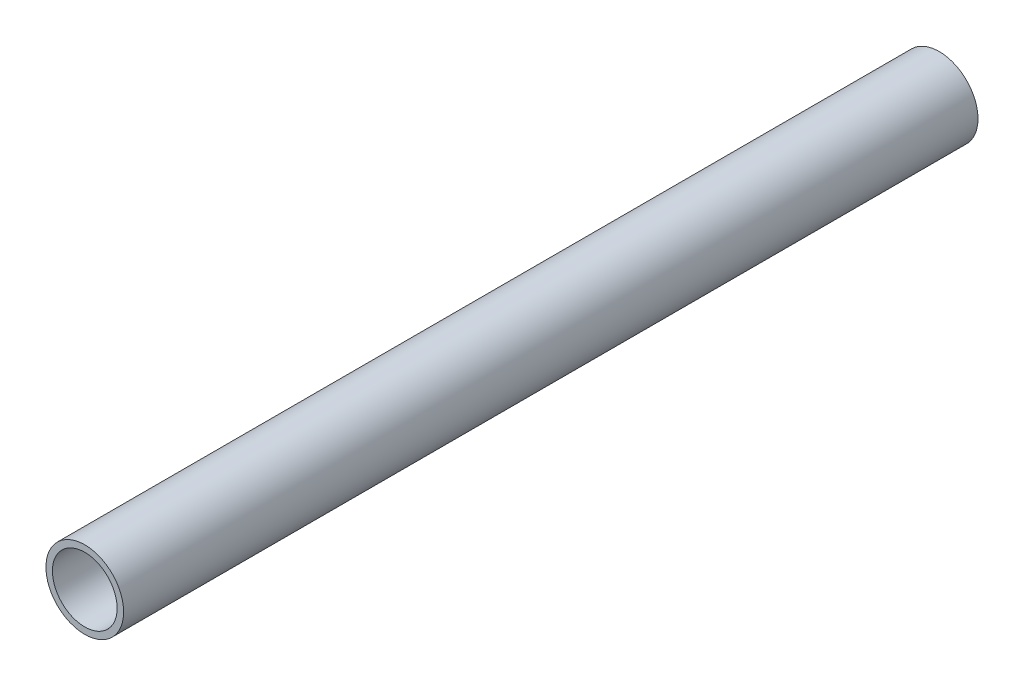
ISO-10303-21;
HEADER;
FILE_DESCRIPTION(('STEP AP214'),'2;1');
FILE_NAME('part.step','',(''),(''),'','','');
FILE_SCHEMA(('AUTOMOTIVE_DESIGN { 1 0 10303 214 1 1 1 1 }'));
ENDSEC;
DATA;
#1=APPLICATION_CONTEXT('core data for automotive mechanical design processes');
#2=APPLICATION_PROTOCOL_DEFINITION('international standard','automotive_design',2000,#1);
#3=PRODUCT_CONTEXT('',#1,'mechanical');
#4=PRODUCT('Part','Part','',(#3));
#5=PRODUCT_RELATED_PRODUCT_CATEGORY('part','',(#4));
#6=PRODUCT_DEFINITION_FORMATION('','',#4);
#7=PRODUCT_DEFINITION_CONTEXT('part definition',#1,'design');
#8=PRODUCT_DEFINITION('design','',#6,#7);
#9=PRODUCT_DEFINITION_SHAPE('','',#8);
#10=(LENGTH_UNIT() NAMED_UNIT(*) SI_UNIT(.MILLI.,.METRE.));
#11=(NAMED_UNIT(*) PLANE_ANGLE_UNIT() SI_UNIT($,.RADIAN.));
#12=(NAMED_UNIT(*) SI_UNIT($,.STERADIAN.) SOLID_ANGLE_UNIT());
#13=UNCERTAINTY_MEASURE_WITH_UNIT(LENGTH_MEASURE(1.E-05),#10,'distance_accuracy_value','');
#14=(GEOMETRIC_REPRESENTATION_CONTEXT(3) GLOBAL_UNCERTAINTY_ASSIGNED_CONTEXT((#13)) GLOBAL_UNIT_ASSIGNED_CONTEXT((#10,
#11,#12)) REPRESENTATION_CONTEXT('',''));
#15=CARTESIAN_POINT('',(0.,0.,0.));
#16=DIRECTION('',(0.,0.,1.));
#17=DIRECTION('',(1.,0.,0.));
#18=AXIS2_PLACEMENT_3D('',#15,#16,#17);
#19=CARTESIAN_POINT('',(-20.2566326631369,12.3556237074161,104.775));
#20=DIRECTION('',(0.,0.,1.));
#21=DIRECTION('',(1.,0.,0.));
#22=AXIS2_PLACEMENT_3D('',#19,#20,#21);
#23=PLANE('',#22);
#24=CARTESIAN_POINT('',(-20.2566326631369,12.3556237074161,104.775));
#25=DIRECTION('',(0.,0.,1.));
#26=DIRECTION('',(1.,0.,0.));
#27=AXIS2_PLACEMENT_3D('',#24,#25,#26);
#28=CIRCLE('',#27,3.96874999999999);
#29=CARTESIAN_POINT('',(-16.2878826631369,12.3556237074161,104.775));
#30=VERTEX_POINT('',#29);
#31=EDGE_CURVE('E55',#30,#30,#28,.T.);
#32=ORIENTED_EDGE('',*,*,#31,.F.);
#33=EDGE_LOOP('',(#32));
#34=FACE_BOUND('',#33,.T.);
#35=CARTESIAN_POINT('',(-20.2566326631369,12.3556237074161,104.775));
#36=DIRECTION('',(0.,0.,1.));
#37=DIRECTION('',(1.,0.,0.));
#38=AXIS2_PLACEMENT_3D('',#35,#36,#37);
#39=CIRCLE('',#38,4.7625);
#40=CARTESIAN_POINT('',(-15.4941326631369,12.3556237074161,104.775));
#41=VERTEX_POINT('',#40);
#42=EDGE_CURVE('E10',#41,#41,#39,.T.);
#43=ORIENTED_EDGE('',*,*,#42,.T.);
#44=EDGE_LOOP('',(#43));
#45=FACE_BOUND('',#44,.T.);
#46=ADVANCED_FACE('F35',(#34,#45),#23,.T.);
#47=CARTESIAN_POINT('',(-20.2566326631369,12.3556237074161,0.));
#48=DIRECTION('',(0.,0.,1.));
#49=DIRECTION('',(1.,0.,0.));
#50=AXIS2_PLACEMENT_3D('',#47,#48,#49);
#51=PLANE('',#50);
#52=CARTESIAN_POINT('',(-20.2566326631369,12.3556237074161,0.));
#53=DIRECTION('',(0.,0.,1.));
#54=DIRECTION('',(1.,0.,0.));
#55=AXIS2_PLACEMENT_3D('',#52,#53,#54);
#56=CIRCLE('',#55,4.7625);
#57=CARTESIAN_POINT('',(-15.4941326631369,12.3556237074161,0.));
#58=VERTEX_POINT('',#57);
#59=EDGE_CURVE('E43',#58,#58,#56,.T.);
#60=ORIENTED_EDGE('',*,*,#59,.F.);
#61=EDGE_LOOP('',(#60));
#62=FACE_BOUND('',#61,.T.);
#63=CARTESIAN_POINT('',(-20.2566326631369,12.3556237074161,0.));
#64=DIRECTION('',(0.,0.,1.));
#65=DIRECTION('',(1.,0.,0.));
#66=AXIS2_PLACEMENT_3D('',#63,#64,#65);
#67=CIRCLE('',#66,3.2004);
#68=CARTESIAN_POINT('',(-17.0562326631369,12.3556237074161,0.));
#69=VERTEX_POINT('',#68);
#70=EDGE_CURVE('E48',#69,#69,#67,.T.);
#71=ORIENTED_EDGE('',*,*,#70,.T.);
#72=EDGE_LOOP('',(#71));
#73=FACE_BOUND('',#72,.T.);
#74=ADVANCED_FACE('F62',(#62,#73),#51,.F.);
#75=CARTESIAN_POINT('',(-20.2566326631369,12.3556237074161,104.775));
#76=DIRECTION('',(0.,0.,-1.));
#77=DIRECTION('',(-1.,0.,0.));
#78=AXIS2_PLACEMENT_3D('',#75,#76,#77);
#79=CYLINDRICAL_SURFACE('',#78,4.7625);
#80=ORIENTED_EDGE('',*,*,#42,.F.);
#81=EDGE_LOOP('',(#80));
#82=FACE_BOUND('',#81,.T.);
#83=ORIENTED_EDGE('',*,*,#59,.T.);
#84=EDGE_LOOP('',(#83));
#85=FACE_BOUND('',#84,.T.);
#86=ADVANCED_FACE('F37',(#82,#85),#79,.T.);
#87=CARTESIAN_POINT('',(-20.2566326631369,12.3556237074161,104.775));
#88=DIRECTION('',(0.,0.,-1.));
#89=DIRECTION('',(-1.,0.,0.));
#90=AXIS2_PLACEMENT_3D('',#87,#88,#89);
#91=CYLINDRICAL_SURFACE('',#90,3.2004);
#92=CARTESIAN_POINT('',(-20.2566326631369,12.3556237074161,80.4373287433702));
#93=DIRECTION('',(0.,0.,1.));
#94=DIRECTION('',(1.,0.,0.));
#95=AXIS2_PLACEMENT_3D('',#92,#93,#94);
#96=CIRCLE('',#95,3.2004);
#97=CARTESIAN_POINT('',(-17.0562326631369,12.3556237074161,80.4373287433702));
#98=VERTEX_POINT('',#97);
#99=EDGE_CURVE('E39',#98,#98,#96,.F.);
#100=ORIENTED_EDGE('',*,*,#99,.F.);
#101=EDGE_LOOP('',(#100));
#102=FACE_BOUND('',#101,.T.);
#103=ORIENTED_EDGE('',*,*,#70,.F.);
#104=EDGE_LOOP('',(#103));
#105=FACE_BOUND('',#104,.T.);
#106=ADVANCED_FACE('F69',(#102,#105),#91,.F.);
#107=CARTESIAN_POINT('',(-20.2566326631369,12.3556237074161,80.899));
#108=DIRECTION('',(0.,0.,1.));
#109=DIRECTION('',(1.,0.,0.));
#110=AXIS2_PLACEMENT_3D('',#107,#108,#109);
#111=CONICAL_SURFACE('',#110,3.96874999999999,1.02974425867665);
#112=ORIENTED_EDGE('',*,*,#99,.T.);
#113=EDGE_LOOP('',(#112));
#114=FACE_BOUND('',#113,.T.);
#115=CARTESIAN_POINT('',(-20.2566326631369,12.3556237074161,80.899));
#116=DIRECTION('',(0.,0.,1.));
#117=DIRECTION('',(1.,0.,0.));
#118=AXIS2_PLACEMENT_3D('',#115,#116,#117);
#119=CIRCLE('',#118,3.96874999999999);
#120=CARTESIAN_POINT('',(-16.2878826631369,12.3556237074161,80.899));
#121=VERTEX_POINT('',#120);
#122=EDGE_CURVE('E52',#121,#121,#119,.T.);
#123=ORIENTED_EDGE('',*,*,#122,.T.);
#124=EDGE_LOOP('',(#123));
#125=FACE_BOUND('',#124,.T.);
#126=ADVANCED_FACE('F72',(#114,#125),#111,.F.);
#127=CARTESIAN_POINT('',(-20.2566326631369,12.3556237074161,104.775));
#128=DIRECTION('',(0.,0.,1.));
#129=DIRECTION('',(1.,0.,0.));
#130=AXIS2_PLACEMENT_3D('',#127,#128,#129);
#131=CYLINDRICAL_SURFACE('',#130,3.96874999999999);
#132=ORIENTED_EDGE('',*,*,#122,.F.);
#133=EDGE_LOOP('',(#132));
#134=FACE_BOUND('',#133,.T.);
#135=ORIENTED_EDGE('',*,*,#31,.T.);
#136=EDGE_LOOP('',(#135));
#137=FACE_BOUND('',#136,.T.);
#138=ADVANCED_FACE('F59',(#134,#137),#131,.F.);
#139=CLOSED_SHELL('',(#46,#74,#86,#106,#126,#138));
#140=MANIFOLD_SOLID_BREP('B2',#139);
#141=ADVANCED_BREP_SHAPE_REPRESENTATION('',(#18,#140),#14);
#142=SHAPE_DEFINITION_REPRESENTATION(#9,#141);
ENDSEC;
END-ISO-10303-21;
